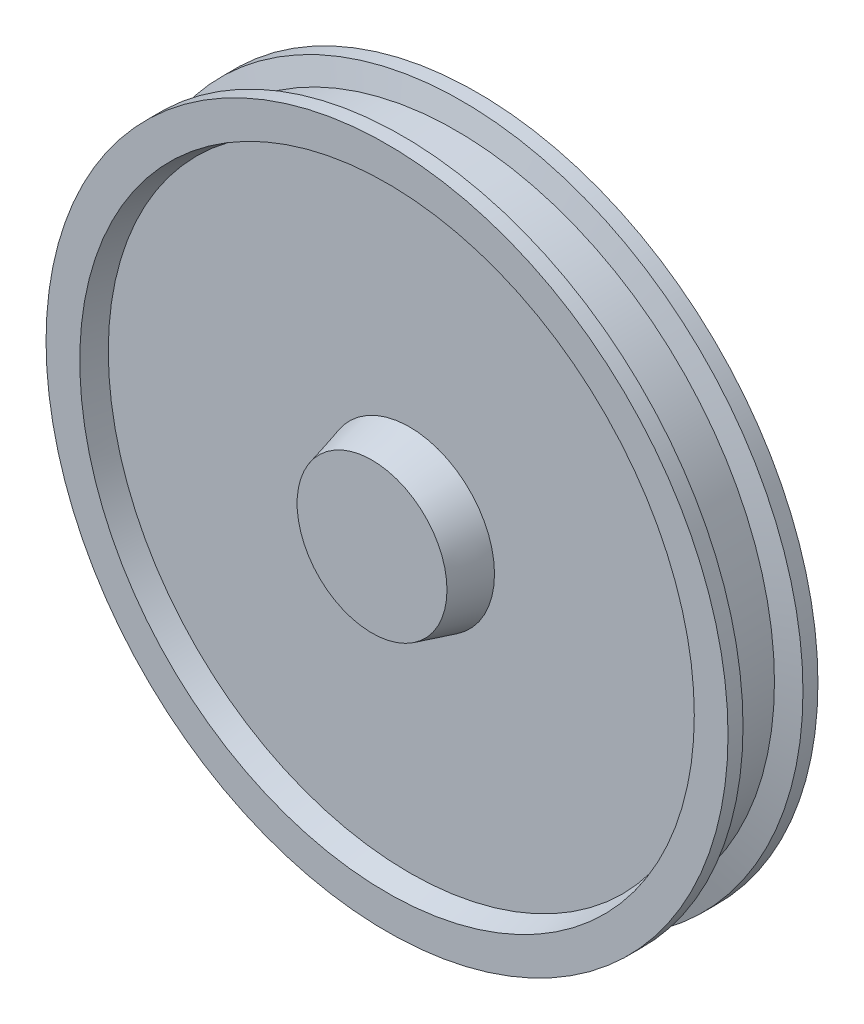
ISO-10303-21;
HEADER;
FILE_DESCRIPTION(('STEP AP214'),'2;1');
FILE_NAME('part.step','',(''),(''),'','','');
FILE_SCHEMA(('AUTOMOTIVE_DESIGN { 1 0 10303 214 1 1 1 1 }'));
ENDSEC;
DATA;
#1=APPLICATION_CONTEXT('core data for automotive mechanical design processes');
#2=APPLICATION_PROTOCOL_DEFINITION('international standard','automotive_design',2000,#1);
#3=PRODUCT_CONTEXT('',#1,'mechanical');
#4=PRODUCT('Part','Part','',(#3));
#5=PRODUCT_RELATED_PRODUCT_CATEGORY('part','',(#4));
#6=PRODUCT_DEFINITION_FORMATION('','',#4);
#7=PRODUCT_DEFINITION_CONTEXT('part definition',#1,'design');
#8=PRODUCT_DEFINITION('design','',#6,#7);
#9=PRODUCT_DEFINITION_SHAPE('','',#8);
#10=(LENGTH_UNIT() NAMED_UNIT(*) SI_UNIT(.MILLI.,.METRE.));
#11=(NAMED_UNIT(*) PLANE_ANGLE_UNIT() SI_UNIT($,.RADIAN.));
#12=(NAMED_UNIT(*) SI_UNIT($,.STERADIAN.) SOLID_ANGLE_UNIT());
#13=UNCERTAINTY_MEASURE_WITH_UNIT(LENGTH_MEASURE(1.E-05),#10,'distance_accuracy_value','');
#14=(GEOMETRIC_REPRESENTATION_CONTEXT(3) GLOBAL_UNCERTAINTY_ASSIGNED_CONTEXT((#13)) GLOBAL_UNIT_ASSIGNED_CONTEXT((#10,
#11,#12)) REPRESENTATION_CONTEXT('',''));
#15=CARTESIAN_POINT('',(0.,0.,0.));
#16=DIRECTION('',(0.,0.,1.));
#17=DIRECTION('',(1.,0.,0.));
#18=AXIS2_PLACEMENT_3D('',#15,#16,#17);
#19=CARTESIAN_POINT('',(0.,100.,80.));
#20=DIRECTION('',(0.,0.,-1.));
#21=DIRECTION('',(-1.,0.,0.));
#22=AXIS2_PLACEMENT_3D('',#19,#20,#21);
#23=PLANE('',#22);
#24=CARTESIAN_POINT('',(0.,0.,80.0000000000001));
#25=DIRECTION('',(0.,0.,1.));
#26=DIRECTION('',(1.,0.,0.));
#27=AXIS2_PLACEMENT_3D('',#24,#25,#26);
#28=CIRCLE('',#27,100.);
#29=CARTESIAN_POINT('',(100.,0.,80.0000000000001));
#30=VERTEX_POINT('',#29);
#31=EDGE_CURVE('E81',#30,#30,#28,.T.);
#32=ORIENTED_EDGE('',*,*,#31,.T.);
#33=EDGE_LOOP('',(#32));
#34=FACE_BOUND('',#33,.T.);
#35=ADVANCED_FACE('F35',(#34),#23,.F.);
#36=CARTESIAN_POINT('',(0.,0.,-80.));
#37=DIRECTION('',(0.,0.,1.));
#38=DIRECTION('',(1.,0.,0.));
#39=AXIS2_PLACEMENT_3D('',#36,#37,#38);
#40=PLANE('',#39);
#41=CARTESIAN_POINT('',(0.,0.,-80.0000000000001));
#42=DIRECTION('',(0.,0.,1.));
#43=DIRECTION('',(1.,0.,0.));
#44=AXIS2_PLACEMENT_3D('',#41,#42,#43);
#45=CIRCLE('',#44,100.);
#46=CARTESIAN_POINT('',(100.,0.,-80.0000000000001));
#47=VERTEX_POINT('',#46);
#48=EDGE_CURVE('E10',#47,#47,#45,.T.);
#49=ORIENTED_EDGE('',*,*,#48,.F.);
#50=EDGE_LOOP('',(#49));
#51=FACE_BOUND('',#50,.T.);
#52=ADVANCED_FACE('F159',(#51),#40,.F.);
#53=CARTESIAN_POINT('',(0.,0.,-80.0000000000001));
#54=DIRECTION('',(0.,0.,1.));
#55=DIRECTION('',(1.,0.,0.));
#56=AXIS2_PLACEMENT_3D('',#53,#54,#55);
#57=CONICAL_SURFACE('',#56,100.,0.261799387799147);
#58=CARTESIAN_POINT('',(0.,0.,-30.));
#59=DIRECTION('',(0.,0.,1.));
#60=DIRECTION('',(1.,0.,0.));
#61=AXIS2_PLACEMENT_3D('',#58,#59,#60);
#62=CIRCLE('',#61,113.397459621556);
#63=CARTESIAN_POINT('',(113.397459621556,0.,-30.));
#64=VERTEX_POINT('',#63);
#65=EDGE_CURVE('E41',#64,#64,#62,.T.);
#66=ORIENTED_EDGE('',*,*,#65,.F.);
#67=EDGE_LOOP('',(#66));
#68=FACE_BOUND('',#67,.T.);
#69=ORIENTED_EDGE('',*,*,#48,.T.);
#70=EDGE_LOOP('',(#69));
#71=FACE_BOUND('',#70,.T.);
#72=ADVANCED_FACE('F154',(#68,#71),#57,.T.);
#73=CARTESIAN_POINT('',(0.,113.397459621556,-30.));
#74=DIRECTION('',(0.,0.,1.));
#75=DIRECTION('',(1.,0.,0.));
#76=AXIS2_PLACEMENT_3D('',#73,#74,#75);
#77=PLANE('',#76);
#78=CARTESIAN_POINT('',(0.,0.,-30.));
#79=DIRECTION('',(0.,0.,1.));
#80=DIRECTION('',(1.,0.,0.));
#81=AXIS2_PLACEMENT_3D('',#78,#79,#80);
#82=CIRCLE('',#81,401.961524227066);
#83=CARTESIAN_POINT('',(401.961524227066,0.,-30.));
#84=VERTEX_POINT('',#83);
#85=EDGE_CURVE('E45',#84,#84,#82,.T.);
#86=ORIENTED_EDGE('',*,*,#85,.F.);
#87=EDGE_LOOP('',(#86));
#88=FACE_BOUND('',#87,.T.);
#89=ORIENTED_EDGE('',*,*,#65,.T.);
#90=EDGE_LOOP('',(#89));
#91=FACE_BOUND('',#90,.T.);
#92=ADVANCED_FACE('F149',(#88,#91),#77,.F.);
#93=CARTESIAN_POINT('',(0.,0.,-30.));
#94=DIRECTION('',(0.,0.,-1.));
#95=DIRECTION('',(-1.,0.,0.));
#96=AXIS2_PLACEMENT_3D('',#93,#94,#95);
#97=CONICAL_SURFACE('',#96,401.961524227066,0.261799387799147);
#98=CARTESIAN_POINT('',(0.,0.,-60.0000000000001));
#99=DIRECTION('',(0.,0.,1.));
#100=DIRECTION('',(1.,0.,0.));
#101=AXIS2_PLACEMENT_3D('',#98,#99,#100);
#102=CIRCLE('',#101,410.);
#103=CARTESIAN_POINT('',(410.,0.,-60.0000000000001));
#104=VERTEX_POINT('',#103);
#105=EDGE_CURVE('E49',#104,#104,#102,.T.);
#106=ORIENTED_EDGE('',*,*,#105,.F.);
#107=EDGE_LOOP('',(#106));
#108=FACE_BOUND('',#107,.T.);
#109=ORIENTED_EDGE('',*,*,#85,.T.);
#110=EDGE_LOOP('',(#109));
#111=FACE_BOUND('',#110,.T.);
#112=ADVANCED_FACE('F143',(#108,#111),#97,.F.);
#113=CARTESIAN_POINT('',(0.,410.,-60.));
#114=DIRECTION('',(0.,0.,1.));
#115=DIRECTION('',(1.,0.,0.));
#116=AXIS2_PLACEMENT_3D('',#113,#114,#115);
#117=PLANE('',#116);
#118=CARTESIAN_POINT('',(0.,0.,-60.0000000000001));
#119=DIRECTION('',(0.,0.,1.));
#120=DIRECTION('',(1.,0.,0.));
#121=AXIS2_PLACEMENT_3D('',#118,#119,#120);
#122=CIRCLE('',#121,455.);
#123=CARTESIAN_POINT('',(455.,0.,-60.0000000000001));
#124=VERTEX_POINT('',#123);
#125=EDGE_CURVE('E54',#124,#124,#122,.T.);
#126=ORIENTED_EDGE('',*,*,#125,.F.);
#127=EDGE_LOOP('',(#126));
#128=FACE_BOUND('',#127,.T.);
#129=ORIENTED_EDGE('',*,*,#105,.T.);
#130=EDGE_LOOP('',(#129));
#131=FACE_BOUND('',#130,.T.);
#132=ADVANCED_FACE('F137',(#128,#131),#117,.F.);
#133=CARTESIAN_POINT('',(0.,0.,1000.));
#134=DIRECTION('',(0.,0.,1.));
#135=DIRECTION('',(1.,0.,0.));
#136=AXIS2_PLACEMENT_3D('',#133,#134,#135);
#137=CYLINDRICAL_SURFACE('',#136,455.);
#138=CARTESIAN_POINT('',(0.,0.,-40.));
#139=DIRECTION('',(0.,0.,1.));
#140=DIRECTION('',(1.,0.,0.));
#141=AXIS2_PLACEMENT_3D('',#138,#139,#140);
#142=CIRCLE('',#141,455.);
#143=CARTESIAN_POINT('',(455.,0.,-40.));
#144=VERTEX_POINT('',#143);
#145=EDGE_CURVE('E57',#144,#144,#142,.T.);
#146=ORIENTED_EDGE('',*,*,#145,.F.);
#147=EDGE_LOOP('',(#146));
#148=FACE_BOUND('',#147,.T.);
#149=ORIENTED_EDGE('',*,*,#125,.T.);
#150=EDGE_LOOP('',(#149));
#151=FACE_BOUND('',#150,.T.);
#152=ADVANCED_FACE('F131',(#148,#151),#137,.T.);
#153=CARTESIAN_POINT('',(0.,0.,-40.));
#154=DIRECTION('',(0.,0.,-1.));
#155=DIRECTION('',(-1.,0.,0.));
#156=AXIS2_PLACEMENT_3D('',#153,#154,#155);
#157=CONICAL_SURFACE('',#156,455.,1.30899693899575);
#158=CARTESIAN_POINT('',(0.,0.,-31.9615242270663));
#159=DIRECTION('',(0.,0.,1.));
#160=DIRECTION('',(1.,0.,0.));
#161=AXIS2_PLACEMENT_3D('',#158,#159,#160);
#162=CIRCLE('',#161,425.);
#163=CARTESIAN_POINT('',(425.,0.,-31.9615242270663));
#164=VERTEX_POINT('',#163);
#165=EDGE_CURVE('E60',#164,#164,#162,.T.);
#166=ORIENTED_EDGE('',*,*,#165,.F.);
#167=EDGE_LOOP('',(#166));
#168=FACE_BOUND('',#167,.T.);
#169=ORIENTED_EDGE('',*,*,#145,.T.);
#170=EDGE_LOOP('',(#169));
#171=FACE_BOUND('',#170,.T.);
#172=ADVANCED_FACE('F125',(#168,#171),#157,.T.);
#173=CARTESIAN_POINT('',(0.,0.,1000.));
#174=DIRECTION('',(0.,0.,1.));
#175=DIRECTION('',(1.,0.,0.));
#176=AXIS2_PLACEMENT_3D('',#173,#174,#175);
#177=CYLINDRICAL_SURFACE('',#176,425.);
#178=CARTESIAN_POINT('',(0.,0.,31.9615242270663));
#179=DIRECTION('',(0.,0.,1.));
#180=DIRECTION('',(1.,0.,0.));
#181=AXIS2_PLACEMENT_3D('',#178,#179,#180);
#182=CIRCLE('',#181,425.);
#183=CARTESIAN_POINT('',(425.,0.,31.9615242270663));
#184=VERTEX_POINT('',#183);
#185=EDGE_CURVE('E63',#184,#184,#182,.T.);
#186=ORIENTED_EDGE('',*,*,#185,.F.);
#187=EDGE_LOOP('',(#186));
#188=FACE_BOUND('',#187,.T.);
#189=ORIENTED_EDGE('',*,*,#165,.T.);
#190=EDGE_LOOP('',(#189));
#191=FACE_BOUND('',#190,.T.);
#192=ADVANCED_FACE('F119',(#188,#191),#177,.T.);
#193=CARTESIAN_POINT('',(0.,0.,31.9615242270663));
#194=DIRECTION('',(0.,0.,1.));
#195=DIRECTION('',(1.,0.,0.));
#196=AXIS2_PLACEMENT_3D('',#193,#194,#195);
#197=CONICAL_SURFACE('',#196,425.,1.30899693899575);
#198=CARTESIAN_POINT('',(0.,0.,39.9999999999999));
#199=DIRECTION('',(0.,0.,1.));
#200=DIRECTION('',(1.,0.,0.));
#201=AXIS2_PLACEMENT_3D('',#198,#199,#200);
#202=CIRCLE('',#201,455.);
#203=CARTESIAN_POINT('',(455.,0.,39.9999999999999));
#204=VERTEX_POINT('',#203);
#205=EDGE_CURVE('E66',#204,#204,#202,.T.);
#206=ORIENTED_EDGE('',*,*,#205,.F.);
#207=EDGE_LOOP('',(#206));
#208=FACE_BOUND('',#207,.T.);
#209=ORIENTED_EDGE('',*,*,#185,.T.);
#210=EDGE_LOOP('',(#209));
#211=FACE_BOUND('',#210,.T.);
#212=ADVANCED_FACE('F113',(#208,#211),#197,.T.);
#213=CARTESIAN_POINT('',(0.,0.,1000.));
#214=DIRECTION('',(0.,0.,1.));
#215=DIRECTION('',(1.,0.,0.));
#216=AXIS2_PLACEMENT_3D('',#213,#214,#215);
#217=CYLINDRICAL_SURFACE('',#216,455.);
#218=CARTESIAN_POINT('',(0.,0.,60.0000000000001));
#219=DIRECTION('',(0.,0.,1.));
#220=DIRECTION('',(1.,0.,0.));
#221=AXIS2_PLACEMENT_3D('',#218,#219,#220);
#222=CIRCLE('',#221,455.);
#223=CARTESIAN_POINT('',(455.,0.,60.0000000000001));
#224=VERTEX_POINT('',#223);
#225=EDGE_CURVE('E69',#224,#224,#222,.T.);
#226=ORIENTED_EDGE('',*,*,#225,.F.);
#227=EDGE_LOOP('',(#226));
#228=FACE_BOUND('',#227,.T.);
#229=ORIENTED_EDGE('',*,*,#205,.T.);
#230=EDGE_LOOP('',(#229));
#231=FACE_BOUND('',#230,.T.);
#232=ADVANCED_FACE('F107',(#228,#231),#217,.T.);
#233=CARTESIAN_POINT('',(0.,455.,60.));
#234=DIRECTION('',(0.,0.,-1.));
#235=DIRECTION('',(-1.,0.,0.));
#236=AXIS2_PLACEMENT_3D('',#233,#234,#235);
#237=PLANE('',#236);
#238=CARTESIAN_POINT('',(0.,0.,60.0000000000001));
#239=DIRECTION('',(0.,0.,1.));
#240=DIRECTION('',(1.,0.,0.));
#241=AXIS2_PLACEMENT_3D('',#238,#239,#240);
#242=CIRCLE('',#241,410.);
#243=CARTESIAN_POINT('',(410.,0.,60.0000000000001));
#244=VERTEX_POINT('',#243);
#245=EDGE_CURVE('E72',#244,#244,#242,.T.);
#246=ORIENTED_EDGE('',*,*,#245,.F.);
#247=EDGE_LOOP('',(#246));
#248=FACE_BOUND('',#247,.T.);
#249=ORIENTED_EDGE('',*,*,#225,.T.);
#250=EDGE_LOOP('',(#249));
#251=FACE_BOUND('',#250,.T.);
#252=ADVANCED_FACE('F101',(#248,#251),#237,.F.);
#253=CARTESIAN_POINT('',(0.,0.,60.0000000000001));
#254=DIRECTION('',(0.,0.,1.));
#255=DIRECTION('',(1.,0.,0.));
#256=AXIS2_PLACEMENT_3D('',#253,#254,#255);
#257=CONICAL_SURFACE('',#256,410.,0.261799387799147);
#258=CARTESIAN_POINT('',(0.,0.,30.));
#259=DIRECTION('',(0.,0.,1.));
#260=DIRECTION('',(1.,0.,0.));
#261=AXIS2_PLACEMENT_3D('',#258,#259,#260);
#262=CIRCLE('',#261,401.961524227066);
#263=CARTESIAN_POINT('',(401.961524227066,0.,30.));
#264=VERTEX_POINT('',#263);
#265=EDGE_CURVE('E75',#264,#264,#262,.T.);
#266=ORIENTED_EDGE('',*,*,#265,.F.);
#267=EDGE_LOOP('',(#266));
#268=FACE_BOUND('',#267,.T.);
#269=ORIENTED_EDGE('',*,*,#245,.T.);
#270=EDGE_LOOP('',(#269));
#271=FACE_BOUND('',#270,.T.);
#272=ADVANCED_FACE('F95',(#268,#271),#257,.F.);
#273=CARTESIAN_POINT('',(0.,401.961524227066,30.));
#274=DIRECTION('',(0.,0.,-1.));
#275=DIRECTION('',(-1.,0.,0.));
#276=AXIS2_PLACEMENT_3D('',#273,#274,#275);
#277=PLANE('',#276);
#278=CARTESIAN_POINT('',(0.,0.,30.));
#279=DIRECTION('',(0.,0.,1.));
#280=DIRECTION('',(1.,0.,0.));
#281=AXIS2_PLACEMENT_3D('',#278,#279,#280);
#282=CIRCLE('',#281,113.397459621556);
#283=CARTESIAN_POINT('',(113.397459621556,0.,30.));
#284=VERTEX_POINT('',#283);
#285=EDGE_CURVE('E78',#284,#284,#282,.T.);
#286=ORIENTED_EDGE('',*,*,#285,.F.);
#287=EDGE_LOOP('',(#286));
#288=FACE_BOUND('',#287,.T.);
#289=ORIENTED_EDGE('',*,*,#265,.T.);
#290=EDGE_LOOP('',(#289));
#291=FACE_BOUND('',#290,.T.);
#292=ADVANCED_FACE('F89',(#288,#291),#277,.F.);
#293=CARTESIAN_POINT('',(0.,0.,30.));
#294=DIRECTION('',(0.,0.,-1.));
#295=DIRECTION('',(-1.,0.,0.));
#296=AXIS2_PLACEMENT_3D('',#293,#294,#295);
#297=CONICAL_SURFACE('',#296,113.397459621556,0.261799387799147);
#298=ORIENTED_EDGE('',*,*,#31,.F.);
#299=EDGE_LOOP('',(#298));
#300=FACE_BOUND('',#299,.T.);
#301=ORIENTED_EDGE('',*,*,#285,.T.);
#302=EDGE_LOOP('',(#301));
#303=FACE_BOUND('',#302,.T.);
#304=ADVANCED_FACE('F86',(#300,#303),#297,.T.);
#305=CLOSED_SHELL('',(#35,#52,#72,#92,#112,#132,#152,#172,#192,#212,#232,#252,#272,#292,#304));
#306=MANIFOLD_SOLID_BREP('B2',#305);
#307=ADVANCED_BREP_SHAPE_REPRESENTATION('',(#18,#306),#14);
#308=SHAPE_DEFINITION_REPRESENTATION(#9,#307);
ENDSEC;
END-ISO-10303-21;
